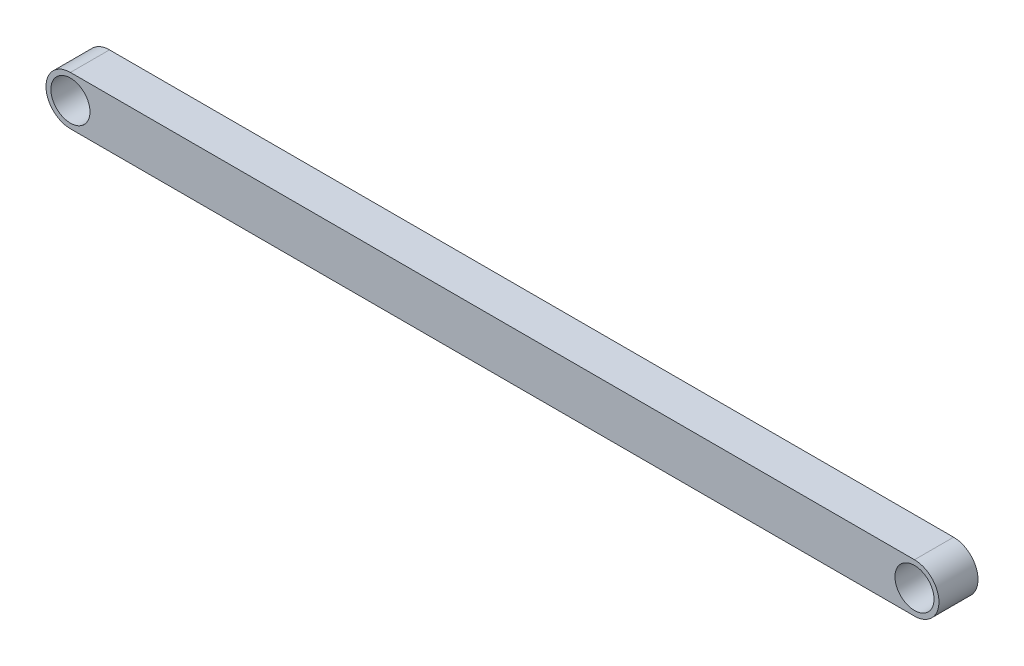
ISO-10303-21;
HEADER;
FILE_DESCRIPTION(('STEP AP214'),'2;1');
FILE_NAME('part.step','',(''),(''),'','','');
FILE_SCHEMA(('AUTOMOTIVE_DESIGN { 1 0 10303 214 1 1 1 1 }'));
ENDSEC;
DATA;
#1=APPLICATION_CONTEXT('core data for automotive mechanical design processes');
#2=APPLICATION_PROTOCOL_DEFINITION('international standard','automotive_design',2000,#1);
#3=PRODUCT_CONTEXT('',#1,'mechanical');
#4=PRODUCT('Part','Part','',(#3));
#5=PRODUCT_RELATED_PRODUCT_CATEGORY('part','',(#4));
#6=PRODUCT_DEFINITION_FORMATION('','',#4);
#7=PRODUCT_DEFINITION_CONTEXT('part definition',#1,'design');
#8=PRODUCT_DEFINITION('design','',#6,#7);
#9=PRODUCT_DEFINITION_SHAPE('','',#8);
#10=(LENGTH_UNIT() NAMED_UNIT(*) SI_UNIT(.MILLI.,.METRE.));
#11=(NAMED_UNIT(*) PLANE_ANGLE_UNIT() SI_UNIT($,.RADIAN.));
#12=(NAMED_UNIT(*) SI_UNIT($,.STERADIAN.) SOLID_ANGLE_UNIT());
#13=UNCERTAINTY_MEASURE_WITH_UNIT(LENGTH_MEASURE(1.E-05),#10,'distance_accuracy_value','');
#14=(GEOMETRIC_REPRESENTATION_CONTEXT(3) GLOBAL_UNCERTAINTY_ASSIGNED_CONTEXT((#13)) GLOBAL_UNIT_ASSIGNED_CONTEXT((#10,
#11,#12)) REPRESENTATION_CONTEXT('',''));
#15=CARTESIAN_POINT('',(0.,0.,0.));
#16=DIRECTION('',(0.,0.,1.));
#17=DIRECTION('',(1.,0.,0.));
#18=AXIS2_PLACEMENT_3D('',#15,#16,#17);
#19=CARTESIAN_POINT('',(0.,0.,2.));
#20=DIRECTION('',(0.,0.,1.));
#21=DIRECTION('',(1.,0.,0.));
#22=AXIS2_PLACEMENT_3D('',#19,#20,#21);
#23=PLANE('',#22);
#24=CARTESIAN_POINT('',(0.,0.,2.));
#25=DIRECTION('',(0.,0.,1.));
#26=DIRECTION('',(1.,0.,0.));
#27=AXIS2_PLACEMENT_3D('',#24,#25,#26);
#28=CIRCLE('',#27,1.);
#29=CARTESIAN_POINT('',(1.,0.,2.));
#30=VERTEX_POINT('',#29);
#31=EDGE_CURVE('E99',#30,#30,#28,.T.);
#32=ORIENTED_EDGE('',*,*,#31,.F.);
#33=EDGE_LOOP('',(#32));
#34=FACE_BOUND('',#33,.T.);
#35=CARTESIAN_POINT('',(0.,0.,2.));
#36=DIRECTION('',(0.,0.,1.));
#37=DIRECTION('',(1.,0.,0.));
#38=AXIS2_PLACEMENT_3D('',#35,#36,#37);
#39=CIRCLE('',#38,1.25);
#40=CARTESIAN_POINT('',(0.,1.25,2.));
#41=VERTEX_POINT('',#40);
#42=CARTESIAN_POINT('',(0.,-1.25,2.));
#43=VERTEX_POINT('',#42);
#44=EDGE_CURVE('E84',#41,#43,#39,.T.);
#45=ORIENTED_EDGE('',*,*,#44,.T.);
#46=DIRECTION('',(1.,0.,0.));
#47=VECTOR('',#46,1.);
#48=CARTESIAN_POINT('',(0.,-1.25,2.));
#49=LINE('',#48,#47);
#50=CARTESIAN_POINT('',(43.2,-1.25,2.));
#51=VERTEX_POINT('',#50);
#52=EDGE_CURVE('E79',#43,#51,#49,.T.);
#53=ORIENTED_EDGE('',*,*,#52,.T.);
#54=CARTESIAN_POINT('',(43.2,0.,2.));
#55=DIRECTION('',(0.,0.,1.));
#56=DIRECTION('',(1.,0.,0.));
#57=AXIS2_PLACEMENT_3D('',#54,#55,#56);
#58=CIRCLE('',#57,1.25);
#59=CARTESIAN_POINT('',(43.2,1.25,2.));
#60=VERTEX_POINT('',#59);
#61=EDGE_CURVE('E82',#51,#60,#58,.T.);
#62=ORIENTED_EDGE('',*,*,#61,.T.);
#63=DIRECTION('',(-1.,0.,0.));
#64=VECTOR('',#63,1.);
#65=CARTESIAN_POINT('',(0.,1.25,2.));
#66=LINE('',#65,#64);
#67=EDGE_CURVE('E49',#60,#41,#66,.T.);
#68=ORIENTED_EDGE('',*,*,#67,.T.);
#69=EDGE_LOOP('',(#45,#53,#62,#68));
#70=FACE_BOUND('',#69,.T.);
#71=CARTESIAN_POINT('',(43.2,0.,2.));
#72=DIRECTION('',(0.,0.,1.));
#73=DIRECTION('',(1.,0.,0.));
#74=AXIS2_PLACEMENT_3D('',#71,#72,#73);
#75=CIRCLE('',#74,0.999999999999998);
#76=CARTESIAN_POINT('',(44.2,0.,2.));
#77=VERTEX_POINT('',#76);
#78=EDGE_CURVE('E114',#77,#77,#75,.T.);
#79=ORIENTED_EDGE('',*,*,#78,.F.);
#80=EDGE_LOOP('',(#79));
#81=FACE_BOUND('',#80,.T.);
#82=ADVANCED_FACE('F32',(#34,#70,#81),#23,.T.);
#83=CARTESIAN_POINT('',(0.,0.,0.));
#84=DIRECTION('',(0.,0.,1.));
#85=DIRECTION('',(1.,0.,0.));
#86=AXIS2_PLACEMENT_3D('',#83,#84,#85);
#87=PLANE('',#86);
#88=CARTESIAN_POINT('',(0.,0.,0.));
#89=DIRECTION('',(0.,0.,1.));
#90=DIRECTION('',(1.,0.,0.));
#91=AXIS2_PLACEMENT_3D('',#88,#89,#90);
#92=CIRCLE('',#91,1.25);
#93=CARTESIAN_POINT('',(0.,1.25,0.));
#94=VERTEX_POINT('',#93);
#95=CARTESIAN_POINT('',(0.,-1.25,0.));
#96=VERTEX_POINT('',#95);
#97=EDGE_CURVE('E96',#94,#96,#92,.T.);
#98=ORIENTED_EDGE('',*,*,#97,.F.);
#99=DIRECTION('',(-1.,0.,0.));
#100=VECTOR('',#99,1.);
#101=CARTESIAN_POINT('',(0.,1.25,0.));
#102=LINE('',#101,#100);
#103=CARTESIAN_POINT('',(43.2,1.25,0.));
#104=VERTEX_POINT('',#103);
#105=EDGE_CURVE('E72',#104,#94,#102,.T.);
#106=ORIENTED_EDGE('',*,*,#105,.F.);
#107=CARTESIAN_POINT('',(43.2,0.,0.));
#108=DIRECTION('',(0.,0.,1.));
#109=DIRECTION('',(1.,0.,0.));
#110=AXIS2_PLACEMENT_3D('',#107,#108,#109);
#111=CIRCLE('',#110,1.25);
#112=CARTESIAN_POINT('',(43.2,-1.25,0.));
#113=VERTEX_POINT('',#112);
#114=EDGE_CURVE('E66',#113,#104,#111,.T.);
#115=ORIENTED_EDGE('',*,*,#114,.F.);
#116=DIRECTION('',(1.,0.,0.));
#117=VECTOR('',#116,1.);
#118=CARTESIAN_POINT('',(0.,-1.25,0.));
#119=LINE('',#118,#117);
#120=EDGE_CURVE('E88',#96,#113,#119,.T.);
#121=ORIENTED_EDGE('',*,*,#120,.F.);
#122=EDGE_LOOP('',(#98,#106,#115,#121));
#123=FACE_BOUND('',#122,.T.);
#124=CARTESIAN_POINT('',(0.,0.,0.));
#125=DIRECTION('',(0.,0.,1.));
#126=DIRECTION('',(1.,0.,0.));
#127=AXIS2_PLACEMENT_3D('',#124,#125,#126);
#128=CIRCLE('',#127,1.);
#129=CARTESIAN_POINT('',(1.,0.,0.));
#130=VERTEX_POINT('',#129);
#131=EDGE_CURVE('E111',#130,#130,#128,.T.);
#132=ORIENTED_EDGE('',*,*,#131,.T.);
#133=EDGE_LOOP('',(#132));
#134=FACE_BOUND('',#133,.T.);
#135=CARTESIAN_POINT('',(43.2,0.,0.));
#136=DIRECTION('',(0.,0.,1.));
#137=DIRECTION('',(1.,0.,0.));
#138=AXIS2_PLACEMENT_3D('',#135,#136,#137);
#139=CIRCLE('',#138,0.999999999999998);
#140=CARTESIAN_POINT('',(44.2,0.,0.));
#141=VERTEX_POINT('',#140);
#142=EDGE_CURVE('E117',#141,#141,#139,.T.);
#143=ORIENTED_EDGE('',*,*,#142,.T.);
#144=EDGE_LOOP('',(#143));
#145=FACE_BOUND('',#144,.T.);
#146=ADVANCED_FACE('F107',(#123,#134,#145),#87,.F.);
#147=CARTESIAN_POINT('',(0.,0.,2.));
#148=DIRECTION('',(0.,0.,-1.));
#149=DIRECTION('',(-1.,0.,0.));
#150=AXIS2_PLACEMENT_3D('',#147,#148,#149);
#151=CYLINDRICAL_SURFACE('',#150,1.25);
#152=ORIENTED_EDGE('',*,*,#97,.T.);
#153=DIRECTION('',(0.,0.,-1.));
#154=VECTOR('',#153,1.);
#155=CARTESIAN_POINT('',(0.,-1.25,2.));
#156=LINE('',#155,#154);
#157=EDGE_CURVE('E11',#43,#96,#156,.T.);
#158=ORIENTED_EDGE('',*,*,#157,.F.);
#159=ORIENTED_EDGE('',*,*,#44,.F.);
#160=DIRECTION('',(0.,0.,-1.));
#161=VECTOR('',#160,1.);
#162=CARTESIAN_POINT('',(0.,1.25,2.));
#163=LINE('',#162,#161);
#164=EDGE_CURVE('E92',#41,#94,#163,.T.);
#165=ORIENTED_EDGE('',*,*,#164,.T.);
#166=EDGE_LOOP('',(#152,#158,#159,#165));
#167=FACE_BOUND('',#166,.T.);
#168=ADVANCED_FACE('F34',(#167),#151,.T.);
#169=CARTESIAN_POINT('',(0.,-1.25,2.));
#170=DIRECTION('',(0.,1.,0.));
#171=DIRECTION('',(0.,0.,1.));
#172=AXIS2_PLACEMENT_3D('',#169,#170,#171);
#173=PLANE('',#172);
#174=ORIENTED_EDGE('',*,*,#120,.T.);
#175=DIRECTION('',(0.,0.,-1.));
#176=VECTOR('',#175,1.);
#177=CARTESIAN_POINT('',(43.2,-1.25,2.));
#178=LINE('',#177,#176);
#179=EDGE_CURVE('E41',#51,#113,#178,.T.);
#180=ORIENTED_EDGE('',*,*,#179,.F.);
#181=ORIENTED_EDGE('',*,*,#52,.F.);
#182=ORIENTED_EDGE('',*,*,#157,.T.);
#183=EDGE_LOOP('',(#174,#180,#181,#182));
#184=FACE_BOUND('',#183,.T.);
#185=ADVANCED_FACE('F87',(#184),#173,.F.);
#186=CARTESIAN_POINT('',(43.2,0.,2.));
#187=DIRECTION('',(0.,0.,-1.));
#188=DIRECTION('',(-1.,0.,0.));
#189=AXIS2_PLACEMENT_3D('',#186,#187,#188);
#190=CYLINDRICAL_SURFACE('',#189,1.25);
#191=ORIENTED_EDGE('',*,*,#114,.T.);
#192=DIRECTION('',(0.,0.,-1.));
#193=VECTOR('',#192,1.);
#194=CARTESIAN_POINT('',(43.2,1.25,2.));
#195=LINE('',#194,#193);
#196=EDGE_CURVE('E89',#60,#104,#195,.T.);
#197=ORIENTED_EDGE('',*,*,#196,.F.);
#198=ORIENTED_EDGE('',*,*,#61,.F.);
#199=ORIENTED_EDGE('',*,*,#179,.T.);
#200=EDGE_LOOP('',(#191,#197,#198,#199));
#201=FACE_BOUND('',#200,.T.);
#202=ADVANCED_FACE('F90',(#201),#190,.T.);
#203=CARTESIAN_POINT('',(0.,1.25,2.));
#204=DIRECTION('',(0.,-1.,0.));
#205=DIRECTION('',(0.,0.,-1.));
#206=AXIS2_PLACEMENT_3D('',#203,#204,#205);
#207=PLANE('',#206);
#208=ORIENTED_EDGE('',*,*,#105,.T.);
#209=ORIENTED_EDGE('',*,*,#164,.F.);
#210=ORIENTED_EDGE('',*,*,#67,.F.);
#211=ORIENTED_EDGE('',*,*,#196,.T.);
#212=EDGE_LOOP('',(#208,#209,#210,#211));
#213=FACE_BOUND('',#212,.T.);
#214=ADVANCED_FACE('F104',(#213),#207,.F.);
#215=CARTESIAN_POINT('',(0.,0.,2.));
#216=DIRECTION('',(0.,0.,-1.));
#217=DIRECTION('',(-1.,0.,0.));
#218=AXIS2_PLACEMENT_3D('',#215,#216,#217);
#219=CYLINDRICAL_SURFACE('',#218,1.);
#220=ORIENTED_EDGE('',*,*,#31,.T.);
#221=EDGE_LOOP('',(#220));
#222=FACE_BOUND('',#221,.T.);
#223=ORIENTED_EDGE('',*,*,#131,.F.);
#224=EDGE_LOOP('',(#223));
#225=FACE_BOUND('',#224,.T.);
#226=ADVANCED_FACE('F134',(#222,#225),#219,.F.);
#227=CARTESIAN_POINT('',(43.2,0.,2.));
#228=DIRECTION('',(0.,0.,-1.));
#229=DIRECTION('',(-1.,0.,0.));
#230=AXIS2_PLACEMENT_3D('',#227,#228,#229);
#231=CYLINDRICAL_SURFACE('',#230,0.999999999999998);
#232=ORIENTED_EDGE('',*,*,#78,.T.);
#233=EDGE_LOOP('',(#232));
#234=FACE_BOUND('',#233,.T.);
#235=ORIENTED_EDGE('',*,*,#142,.F.);
#236=EDGE_LOOP('',(#235));
#237=FACE_BOUND('',#236,.T.);
#238=ADVANCED_FACE('F123',(#234,#237),#231,.F.);
#239=CLOSED_SHELL('',(#82,#146,#168,#185,#202,#214,#226,#238));
#240=MANIFOLD_SOLID_BREP('B2',#239);
#241=ADVANCED_BREP_SHAPE_REPRESENTATION('',(#18,#240),#14);
#242=SHAPE_DEFINITION_REPRESENTATION(#9,#241);
ENDSEC;
END-ISO-10303-21;
